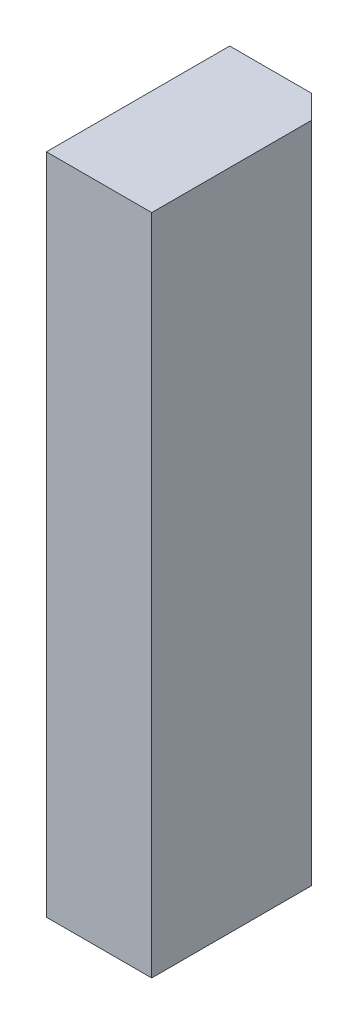
ISO-10303-21;
HEADER;
FILE_DESCRIPTION(('STEP AP214'),'2;1');
FILE_NAME('part.step','',(''),(''),'','','');
FILE_SCHEMA(('AUTOMOTIVE_DESIGN { 1 0 10303 214 1 1 1 1 }'));
ENDSEC;
DATA;
#1=APPLICATION_CONTEXT('core data for automotive mechanical design processes');
#2=APPLICATION_PROTOCOL_DEFINITION('international standard','automotive_design',2000,#1);
#3=PRODUCT_CONTEXT('',#1,'mechanical');
#4=PRODUCT('Part','Part','',(#3));
#5=PRODUCT_RELATED_PRODUCT_CATEGORY('part','',(#4));
#6=PRODUCT_DEFINITION_FORMATION('','',#4);
#7=PRODUCT_DEFINITION_CONTEXT('part definition',#1,'design');
#8=PRODUCT_DEFINITION('design','',#6,#7);
#9=PRODUCT_DEFINITION_SHAPE('','',#8);
#10=(LENGTH_UNIT() NAMED_UNIT(*) SI_UNIT(.MILLI.,.METRE.));
#11=(NAMED_UNIT(*) PLANE_ANGLE_UNIT() SI_UNIT($,.RADIAN.));
#12=(NAMED_UNIT(*) SI_UNIT($,.STERADIAN.) SOLID_ANGLE_UNIT());
#13=UNCERTAINTY_MEASURE_WITH_UNIT(LENGTH_MEASURE(1.E-05),#10,'distance_accuracy_value','');
#14=(GEOMETRIC_REPRESENTATION_CONTEXT(3) GLOBAL_UNCERTAINTY_ASSIGNED_CONTEXT((#13)) GLOBAL_UNIT_ASSIGNED_CONTEXT((#10,
#11,#12)) REPRESENTATION_CONTEXT('',''));
#15=CARTESIAN_POINT('',(0.,0.,0.));
#16=DIRECTION('',(0.,0.,1.));
#17=DIRECTION('',(1.,0.,0.));
#18=AXIS2_PLACEMENT_3D('',#15,#16,#17);
#19=CARTESIAN_POINT('',(-1.35,17.,-2.34999999999999));
#20=DIRECTION('',(0.,0.,1.));
#21=DIRECTION('',(1.,0.,0.));
#22=AXIS2_PLACEMENT_3D('',#19,#20,#21);
#23=PLANE('',#22);
#24=DIRECTION('',(0.,-1.,0.));
#25=VECTOR('',#24,1.);
#26=CARTESIAN_POINT('',(0.749999999999997,17.,-2.34999999999999));
#27=LINE('',#26,#25);
#28=CARTESIAN_POINT('',(0.749999999999997,17.,-2.34999999999999));
#29=VERTEX_POINT('',#28);
#30=CARTESIAN_POINT('',(0.749999999999997,1.48989794855664,-2.34999999999999));
#31=VERTEX_POINT('',#30);
#32=EDGE_CURVE('E103',#29,#31,#27,.T.);
#33=ORIENTED_EDGE('',*,*,#32,.T.);
#34=DIRECTION('',(-1.,0.,0.));
#35=VECTOR('',#34,1.);
#36=CARTESIAN_POINT('',(1.351,1.48989794855664,-2.34999999999999));
#37=LINE('',#36,#35);
#38=CARTESIAN_POINT('',(-1.35,1.48989794855664,-2.34999999999999));
#39=VERTEX_POINT('',#38);
#40=EDGE_CURVE('E45',#39,#31,#37,.F.);
#41=ORIENTED_EDGE('',*,*,#40,.F.);
#42=DIRECTION('',(0.,-1.,0.));
#43=VECTOR('',#42,1.);
#44=CARTESIAN_POINT('',(-1.35,17.,-2.34999999999999));
#45=LINE('',#44,#43);
#46=CARTESIAN_POINT('',(-1.35,17.,-2.34999999999999));
#47=VERTEX_POINT('',#46);
#48=EDGE_CURVE('E100',#47,#39,#45,.T.);
#49=ORIENTED_EDGE('',*,*,#48,.F.);
#50=DIRECTION('',(-1.,0.,0.));
#51=VECTOR('',#50,1.);
#52=CARTESIAN_POINT('',(-1.35,17.,-2.34999999999999));
#53=LINE('',#52,#51);
#54=EDGE_CURVE('E137',#29,#47,#53,.T.);
#55=ORIENTED_EDGE('',*,*,#54,.F.);
#56=EDGE_LOOP('',(#33,#41,#49,#55));
#57=FACE_BOUND('',#56,.T.);
#58=ADVANCED_FACE('F30',(#57),#23,.F.);
#59=CARTESIAN_POINT('',(1.35,17.,-2.34999999999999));
#60=DIRECTION('',(-1.,0.,0.));
#61=DIRECTION('',(0.,0.,1.));
#62=AXIS2_PLACEMENT_3D('',#59,#60,#61);
#63=PLANE('',#62);
#64=DIRECTION('',(0.,0.,-1.));
#65=VECTOR('',#64,1.);
#66=CARTESIAN_POINT('',(1.35,0.,-2.34999999999999));
#67=LINE('',#66,#65);
#68=CARTESIAN_POINT('',(1.35,0.,2.35000000000002));
#69=VERTEX_POINT('',#68);
#70=CARTESIAN_POINT('',(1.35,0.,-1.74999999999999));
#71=VERTEX_POINT('',#70);
#72=EDGE_CURVE('E123',#69,#71,#67,.T.);
#73=ORIENTED_EDGE('',*,*,#72,.T.);
#74=DIRECTION('',(0.,1.,0.));
#75=VECTOR('',#74,1.);
#76=CARTESIAN_POINT('',(1.35,17.,-1.74999999999999));
#77=LINE('',#76,#75);
#78=CARTESIAN_POINT('',(1.35,17.,-1.74999999999999));
#79=VERTEX_POINT('',#78);
#80=EDGE_CURVE('E38',#71,#79,#77,.T.);
#81=ORIENTED_EDGE('',*,*,#80,.T.);
#82=DIRECTION('',(0.,0.,-1.));
#83=VECTOR('',#82,1.);
#84=CARTESIAN_POINT('',(1.35,17.,-2.34999999999999));
#85=LINE('',#84,#83);
#86=CARTESIAN_POINT('',(1.35,17.,2.35000000000002));
#87=VERTEX_POINT('',#86);
#88=EDGE_CURVE('E138',#87,#79,#85,.T.);
#89=ORIENTED_EDGE('',*,*,#88,.F.);
#90=DIRECTION('',(0.,-1.,0.));
#91=VECTOR('',#90,1.);
#92=CARTESIAN_POINT('',(1.35,17.,2.35000000000002));
#93=LINE('',#92,#91);
#94=EDGE_CURVE('E132',#87,#69,#93,.T.);
#95=ORIENTED_EDGE('',*,*,#94,.T.);
#96=EDGE_LOOP('',(#73,#81,#89,#95));
#97=FACE_BOUND('',#96,.T.);
#98=ADVANCED_FACE('F130',(#97),#63,.F.);
#99=CARTESIAN_POINT('',(-1.35,0.510102051443362,-2.34999999999999));
#100=VERTEX_POINT('',#99);
#101=CARTESIAN_POINT('',(-1.35,0.,-2.34999999999999));
#102=VERTEX_POINT('',#101);
#103=EDGE_CURVE('E109',#100,#102,#45,.T.);
#104=ORIENTED_EDGE('',*,*,#103,.F.);
#105=DIRECTION('',(-1.,0.,0.));
#106=VECTOR('',#105,1.);
#107=CARTESIAN_POINT('',(1.351,0.510102051443363,-2.34999999999999));
#108=LINE('',#107,#106);
#109=CARTESIAN_POINT('',(0.749999999999997,0.510102051443362,-2.34999999999999));
#110=VERTEX_POINT('',#109);
#111=EDGE_CURVE('E90',#110,#100,#108,.T.);
#112=ORIENTED_EDGE('',*,*,#111,.F.);
#113=CARTESIAN_POINT('',(0.749999999999997,0.,-2.34999999999999));
#114=VERTEX_POINT('',#113);
#115=EDGE_CURVE('E108',#110,#114,#27,.T.);
#116=ORIENTED_EDGE('',*,*,#115,.T.);
#117=DIRECTION('',(-1.,0.,0.));
#118=VECTOR('',#117,1.);
#119=CARTESIAN_POINT('',(-1.35,0.,-2.34999999999999));
#120=LINE('',#119,#118);
#121=EDGE_CURVE('E126',#114,#102,#120,.T.);
#122=ORIENTED_EDGE('',*,*,#121,.T.);
#123=EDGE_LOOP('',(#104,#112,#116,#122));
#124=FACE_BOUND('',#123,.T.);
#125=ADVANCED_FACE('F155',(#124),#23,.F.);
#126=CARTESIAN_POINT('',(-1.35,17.,-2.34999999999999));
#127=DIRECTION('',(1.,0.,0.));
#128=DIRECTION('',(0.,0.,-1.));
#129=AXIS2_PLACEMENT_3D('',#126,#127,#128);
#130=PLANE('',#129);
#131=ORIENTED_EDGE('',*,*,#48,.T.);
#132=CARTESIAN_POINT('',(-1.35,1.,-2.44999999999998));
#133=DIRECTION('',(-1.,0.,0.));
#134=DIRECTION('',(0.,0.,1.));
#135=AXIS2_PLACEMENT_3D('',#132,#133,#134);
#136=CIRCLE('',#135,0.5);
#137=EDGE_CURVE('E87',#100,#39,#136,.T.);
#138=ORIENTED_EDGE('',*,*,#137,.F.);
#139=ORIENTED_EDGE('',*,*,#103,.T.);
#140=DIRECTION('',(0.,0.,1.));
#141=VECTOR('',#140,1.);
#142=CARTESIAN_POINT('',(-1.35,0.,-2.34999999999999));
#143=LINE('',#142,#141);
#144=CARTESIAN_POINT('',(-1.35,0.,2.35000000000002));
#145=VERTEX_POINT('',#144);
#146=EDGE_CURVE('E148',#102,#145,#143,.T.);
#147=ORIENTED_EDGE('',*,*,#146,.T.);
#148=DIRECTION('',(0.,-1.,0.));
#149=VECTOR('',#148,1.);
#150=CARTESIAN_POINT('',(-1.35,17.,2.35000000000002));
#151=LINE('',#150,#149);
#152=CARTESIAN_POINT('',(-1.35,17.,2.35000000000002));
#153=VERTEX_POINT('',#152);
#154=EDGE_CURVE('E112',#153,#145,#151,.T.);
#155=ORIENTED_EDGE('',*,*,#154,.F.);
#156=DIRECTION('',(0.,0.,1.));
#157=VECTOR('',#156,1.);
#158=CARTESIAN_POINT('',(-1.35,17.,-2.34999999999999));
#159=LINE('',#158,#157);
#160=EDGE_CURVE('E107',#47,#153,#159,.T.);
#161=ORIENTED_EDGE('',*,*,#160,.F.);
#162=EDGE_LOOP('',(#131,#138,#139,#147,#155,#161));
#163=FACE_BOUND('',#162,.T.);
#164=ADVANCED_FACE('F105',(#163),#130,.F.);
#165=CARTESIAN_POINT('',(-1.35,17.,2.35000000000002));
#166=DIRECTION('',(0.,0.,-1.));
#167=DIRECTION('',(-1.,0.,0.));
#168=AXIS2_PLACEMENT_3D('',#165,#166,#167);
#169=PLANE('',#168);
#170=DIRECTION('',(1.,0.,0.));
#171=VECTOR('',#170,1.);
#172=CARTESIAN_POINT('',(-1.35,0.,2.35000000000002));
#173=LINE('',#172,#171);
#174=EDGE_CURVE('E142',#145,#69,#173,.T.);
#175=ORIENTED_EDGE('',*,*,#174,.T.);
#176=ORIENTED_EDGE('',*,*,#94,.F.);
#177=DIRECTION('',(1.,0.,0.));
#178=VECTOR('',#177,1.);
#179=CARTESIAN_POINT('',(-1.35,17.,2.35000000000002));
#180=LINE('',#179,#178);
#181=EDGE_CURVE('E140',#153,#87,#180,.T.);
#182=ORIENTED_EDGE('',*,*,#181,.F.);
#183=ORIENTED_EDGE('',*,*,#154,.T.);
#184=EDGE_LOOP('',(#175,#176,#182,#183));
#185=FACE_BOUND('',#184,.T.);
#186=ADVANCED_FACE('F153',(#185),#169,.F.);
#187=CARTESIAN_POINT('',(1.35,17.,2.35000000000002));
#188=DIRECTION('',(0.,1.,0.));
#189=DIRECTION('',(0.,0.,1.));
#190=AXIS2_PLACEMENT_3D('',#187,#188,#189);
#191=PLANE('',#190);
#192=ORIENTED_EDGE('',*,*,#88,.T.);
#193=DIRECTION('',(0.707106781186547,0.,0.707106781186549));
#194=VECTOR('',#193,1.);
#195=CARTESIAN_POINT('',(3.4,17.,0.30000000000002));
#196=LINE('',#195,#194);
#197=EDGE_CURVE('E11',#79,#29,#196,.F.);
#198=ORIENTED_EDGE('',*,*,#197,.T.);
#199=ORIENTED_EDGE('',*,*,#54,.T.);
#200=ORIENTED_EDGE('',*,*,#160,.T.);
#201=ORIENTED_EDGE('',*,*,#181,.T.);
#202=EDGE_LOOP('',(#192,#198,#199,#200,#201));
#203=FACE_BOUND('',#202,.T.);
#204=ADVANCED_FACE('F136',(#203),#191,.T.);
#205=CARTESIAN_POINT('',(1.35,0.,2.35000000000002));
#206=DIRECTION('',(0.,1.,0.));
#207=DIRECTION('',(0.,0.,1.));
#208=AXIS2_PLACEMENT_3D('',#205,#206,#207);
#209=PLANE('',#208);
#210=ORIENTED_EDGE('',*,*,#121,.F.);
#211=DIRECTION('',(-0.707106781186547,0.,-0.707106781186549));
#212=VECTOR('',#211,1.);
#213=CARTESIAN_POINT('',(0.749999999999997,0.,-2.34999999999999));
#214=LINE('',#213,#212);
#215=EDGE_CURVE('E116',#114,#71,#214,.F.);
#216=ORIENTED_EDGE('',*,*,#215,.T.);
#217=ORIENTED_EDGE('',*,*,#72,.F.);
#218=ORIENTED_EDGE('',*,*,#174,.F.);
#219=ORIENTED_EDGE('',*,*,#146,.F.);
#220=EDGE_LOOP('',(#210,#216,#217,#218,#219));
#221=FACE_BOUND('',#220,.T.);
#222=ADVANCED_FACE('F121',(#221),#209,.F.);
#223=CARTESIAN_POINT('',(0.749999999999997,17.,-2.34999999999999));
#224=DIRECTION('',(-0.707106781186549,0.,0.707106781186547));
#225=DIRECTION('',(0.707106781186547,0.,0.707106781186549));
#226=AXIS2_PLACEMENT_3D('',#223,#224,#225);
#227=PLANE('',#226);
#228=CARTESIAN_POINT('',(0.650000000000007,1.,-2.44999999999998));
#229=DIRECTION('',(-0.707106781186549,0.,0.707106781186547));
#230=DIRECTION('',(-0.707106781186547,0.,-0.707106781186549));
#231=AXIS2_PLACEMENT_3D('',#228,#229,#230);
#232=ELLIPSE('',#231,0.707106781186546,0.5);
#233=EDGE_CURVE('E94',#110,#31,#232,.T.);
#234=ORIENTED_EDGE('',*,*,#233,.T.);
#235=ORIENTED_EDGE('',*,*,#32,.F.);
#236=ORIENTED_EDGE('',*,*,#197,.F.);
#237=ORIENTED_EDGE('',*,*,#80,.F.);
#238=ORIENTED_EDGE('',*,*,#215,.F.);
#239=ORIENTED_EDGE('',*,*,#115,.F.);
#240=EDGE_LOOP('',(#234,#235,#236,#237,#238,#239));
#241=FACE_BOUND('',#240,.T.);
#242=ADVANCED_FACE('F32',(#241),#227,.F.);
#243=CARTESIAN_POINT('',(1.351,1.,-2.44999999999998));
#244=DIRECTION('',(-1.,0.,0.));
#245=DIRECTION('',(0.,0.,1.));
#246=AXIS2_PLACEMENT_3D('',#243,#244,#245);
#247=CYLINDRICAL_SURFACE('',#246,0.5);
#248=ORIENTED_EDGE('',*,*,#40,.T.);
#249=ORIENTED_EDGE('',*,*,#233,.F.);
#250=ORIENTED_EDGE('',*,*,#111,.T.);
#251=ORIENTED_EDGE('',*,*,#137,.T.);
#252=EDGE_LOOP('',(#248,#249,#250,#251));
#253=FACE_BOUND('',#252,.T.);
#254=ADVANCED_FACE('F88',(#253),#247,.F.);
#255=CLOSED_SHELL('',(#58,#98,#125,#164,#186,#204,#222,#242,#254));
#256=MANIFOLD_SOLID_BREP('B2',#255);
#257=ADVANCED_BREP_SHAPE_REPRESENTATION('',(#18,#256),#14);
#258=SHAPE_DEFINITION_REPRESENTATION(#9,#257);
ENDSEC;
END-ISO-10303-21;
